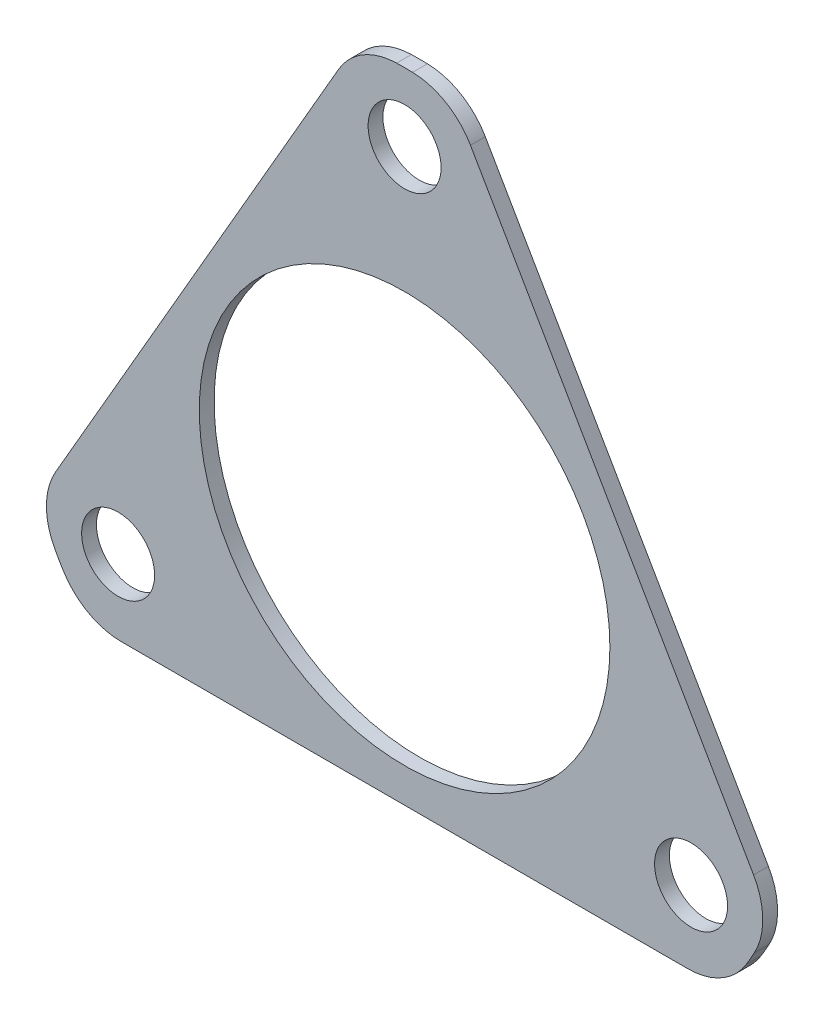
ISO-10303-21;
HEADER;
FILE_DESCRIPTION(('STEP AP214'),'2;1');
FILE_NAME('part.step','',(''),(''),'','','');
FILE_SCHEMA(('AUTOMOTIVE_DESIGN { 1 0 10303 214 1 1 1 1 }'));
ENDSEC;
DATA;
#1=APPLICATION_CONTEXT('core data for automotive mechanical design processes');
#2=APPLICATION_PROTOCOL_DEFINITION('international standard','automotive_design',2000,#1);
#3=PRODUCT_CONTEXT('',#1,'mechanical');
#4=PRODUCT('Part','Part','',(#3));
#5=PRODUCT_RELATED_PRODUCT_CATEGORY('part','',(#4));
#6=PRODUCT_DEFINITION_FORMATION('','',#4);
#7=PRODUCT_DEFINITION_CONTEXT('part definition',#1,'design');
#8=PRODUCT_DEFINITION('design','',#6,#7);
#9=PRODUCT_DEFINITION_SHAPE('','',#8);
#10=(LENGTH_UNIT() NAMED_UNIT(*) SI_UNIT(.MILLI.,.METRE.));
#11=(NAMED_UNIT(*) PLANE_ANGLE_UNIT() SI_UNIT($,.RADIAN.));
#12=(NAMED_UNIT(*) SI_UNIT($,.STERADIAN.) SOLID_ANGLE_UNIT());
#13=UNCERTAINTY_MEASURE_WITH_UNIT(LENGTH_MEASURE(1.E-05),#10,'distance_accuracy_value','');
#14=(GEOMETRIC_REPRESENTATION_CONTEXT(3) GLOBAL_UNCERTAINTY_ASSIGNED_CONTEXT((#13)) GLOBAL_UNIT_ASSIGNED_CONTEXT((#10,
#11,#12)) REPRESENTATION_CONTEXT('',''));
#15=CARTESIAN_POINT('',(0.,0.,0.));
#16=DIRECTION('',(0.,0.,1.));
#17=DIRECTION('',(1.,0.,0.));
#18=AXIS2_PLACEMENT_3D('',#15,#16,#17);
#19=CARTESIAN_POINT('',(0.,0.,8.7));
#20=DIRECTION('',(0.,0.,1.));
#21=DIRECTION('',(1.,0.,0.));
#22=AXIS2_PLACEMENT_3D('',#19,#20,#21);
#23=PLANE('',#22);
#24=CARTESIAN_POINT('',(0.,0.,8.7));
#25=DIRECTION('',(0.,0.,1.));
#26=DIRECTION('',(1.,0.,0.));
#27=AXIS2_PLACEMENT_3D('',#24,#25,#26);
#28=CIRCLE('',#27,18.);
#29=CARTESIAN_POINT('',(18.,0.,8.7));
#30=VERTEX_POINT('',#29);
#31=EDGE_CURVE('E328',#30,#30,#28,.T.);
#32=ORIENTED_EDGE('',*,*,#31,.T.);
#33=EDGE_LOOP('',(#32));
#34=FACE_BOUND('',#33,.T.);
#35=CARTESIAN_POINT('',(0.,29.,8.7));
#36=DIRECTION('',(0.,0.,-1.));
#37=DIRECTION('',(-1.,0.,0.));
#38=AXIS2_PLACEMENT_3D('',#35,#36,#37);
#39=CIRCLE('',#38,3.2);
#40=CARTESIAN_POINT('',(-3.2,29.,8.7));
#41=VERTEX_POINT('',#40);
#42=EDGE_CURVE('E185',#41,#41,#39,.T.);
#43=ORIENTED_EDGE('',*,*,#42,.F.);
#44=EDGE_LOOP('',(#43));
#45=FACE_BOUND('',#44,.T.);
#46=CARTESIAN_POINT('',(-25.1147367097503,-14.4999999999991,8.7));
#47=DIRECTION('',(0.,0.,-1.));
#48=DIRECTION('',(-1.,0.,0.));
#49=AXIS2_PLACEMENT_3D('',#46,#47,#48);
#50=CIRCLE('',#49,3.2);
#51=CARTESIAN_POINT('',(-28.3147367097503,-14.4999999999991,8.7));
#52=VERTEX_POINT('',#51);
#53=EDGE_CURVE('E331',#52,#52,#50,.T.);
#54=ORIENTED_EDGE('',*,*,#53,.F.);
#55=EDGE_LOOP('',(#54));
#56=FACE_BOUND('',#55,.T.);
#57=CARTESIAN_POINT('',(25.1147367097471,-14.5000000000009,8.7));
#58=DIRECTION('',(0.,0.,-1.));
#59=DIRECTION('',(-1.,0.,0.));
#60=AXIS2_PLACEMENT_3D('',#57,#58,#59);
#61=CIRCLE('',#60,3.2);
#62=CARTESIAN_POINT('',(21.9147367097471,-14.5000000000009,8.7));
#63=VERTEX_POINT('',#62);
#64=EDGE_CURVE('E203',#63,#63,#61,.T.);
#65=ORIENTED_EDGE('',*,*,#64,.F.);
#66=EDGE_LOOP('',(#65));
#67=FACE_BOUND('',#66,.T.);
#68=CARTESIAN_POINT('',(0.,0.,8.7));
#69=DIRECTION('',(0.,0.,-1.));
#70=DIRECTION('',(-1.,0.,0.));
#71=AXIS2_PLACEMENT_3D('',#68,#69,#70);
#72=CIRCLE('',#71,35.);
#73=CARTESIAN_POINT('',(-29.9543846627366,-18.1034482758621,8.7));
#74=VERTEX_POINT('',#73);
#75=CARTESIAN_POINT('',(-30.6552384343624,-16.8895339347298,8.7));
#76=VERTEX_POINT('',#75);
#77=EDGE_CURVE('E150',#74,#76,#72,.T.);
#78=ORIENTED_EDGE('',*,*,#77,.T.);
#79=CARTESIAN_POINT('',(-25.4000547027574,-13.9941852602047,8.7));
#80=DIRECTION('',(0.,0.,1.));
#81=DIRECTION('',(1.,0.,0.));
#82=AXIS2_PLACEMENT_3D('',#79,#80,#81);
#83=CIRCLE('',#82,6.);
#84=CARTESIAN_POINT('',(-30.5962071254641,-10.9941852602047,8.7));
#85=VERTEX_POINT('',#84);
#86=EDGE_CURVE('E225',#76,#85,#83,.F.);
#87=ORIENTED_EDGE('',*,*,#86,.T.);
#88=DIRECTION('',(0.5,0.866025403784439,0.));
#89=VECTOR('',#88,1.);
#90=CARTESIAN_POINT('',(-36.3730669589464,-21.,8.7));
#91=LINE('',#90,#89);
#92=CARTESIAN_POINT('',(-5.77685983348236,31.9941852602047,8.7));
#93=VERTEX_POINT('',#92);
#94=EDGE_CURVE('E190',#85,#93,#91,.T.);
#95=ORIENTED_EDGE('',*,*,#94,.T.);
#96=CARTESIAN_POINT('',(-0.580707410775721,28.9941852602047,8.7));
#97=DIRECTION('',(0.,0.,1.));
#98=DIRECTION('',(1.,0.,0.));
#99=AXIS2_PLACEMENT_3D('',#96,#97,#98);
#100=CIRCLE('',#99,6.);
#101=CARTESIAN_POINT('',(-0.700853771625869,34.9929822105919,8.7));
#102=VERTEX_POINT('',#101);
#103=EDGE_CURVE('E217',#93,#102,#100,.F.);
#104=ORIENTED_EDGE('',*,*,#103,.T.);
#105=CARTESIAN_POINT('',(0.700853771625863,34.9929822105919,8.7));
#106=VERTEX_POINT('',#105);
#107=EDGE_CURVE('E158',#102,#106,#72,.T.);
#108=ORIENTED_EDGE('',*,*,#107,.T.);
#109=CARTESIAN_POINT('',(0.580707410775715,28.9941852602047,8.7));
#110=DIRECTION('',(0.,0.,1.));
#111=DIRECTION('',(1.,0.,0.));
#112=AXIS2_PLACEMENT_3D('',#109,#110,#111);
#113=CIRCLE('',#112,6.);
#114=CARTESIAN_POINT('',(5.77685983348235,31.9941852602047,8.7));
#115=VERTEX_POINT('',#114);
#116=EDGE_CURVE('E176',#106,#115,#113,.F.);
#117=ORIENTED_EDGE('',*,*,#116,.T.);
#118=DIRECTION('',(0.5,-0.866025403784439,0.));
#119=VECTOR('',#118,1.);
#120=CARTESIAN_POINT('',(0.,42.,8.7));
#121=LINE('',#120,#119);
#122=CARTESIAN_POINT('',(30.5962071254641,-10.9941852602047,8.7));
#123=VERTEX_POINT('',#122);
#124=EDGE_CURVE('E194',#115,#123,#121,.T.);
#125=ORIENTED_EDGE('',*,*,#124,.T.);
#126=CARTESIAN_POINT('',(25.4000547027574,-13.9941852602047,8.7));
#127=DIRECTION('',(0.,0.,1.));
#128=DIRECTION('',(1.,0.,0.));
#129=AXIS2_PLACEMENT_3D('',#126,#127,#128);
#130=CIRCLE('',#129,6.);
#131=CARTESIAN_POINT('',(30.6552384343624,-16.8895339347298,8.7));
#132=VERTEX_POINT('',#131);
#133=EDGE_CURVE('E219',#123,#132,#130,.F.);
#134=ORIENTED_EDGE('',*,*,#133,.T.);
#135=CARTESIAN_POINT('',(29.9543846627366,-18.1034482758621,8.7));
#136=VERTEX_POINT('',#135);
#137=EDGE_CURVE('E162',#132,#136,#72,.T.);
#138=ORIENTED_EDGE('',*,*,#137,.T.);
#139=CARTESIAN_POINT('',(24.8193472919817,-15.,8.7));
#140=DIRECTION('',(0.,0.,1.));
#141=DIRECTION('',(1.,0.,0.));
#142=AXIS2_PLACEMENT_3D('',#139,#140,#141);
#143=CIRCLE('',#142,6.);
#144=CARTESIAN_POINT('',(24.8193472919817,-21.,8.7));
#145=VERTEX_POINT('',#144);
#146=EDGE_CURVE('E221',#136,#145,#143,.F.);
#147=ORIENTED_EDGE('',*,*,#146,.T.);
#148=DIRECTION('',(-1.,0.,0.));
#149=VECTOR('',#148,1.);
#150=CARTESIAN_POINT('',(36.3730669589464,-21.,8.7));
#151=LINE('',#150,#149);
#152=CARTESIAN_POINT('',(-24.8193472919817,-21.,8.7));
#153=VERTEX_POINT('',#152);
#154=EDGE_CURVE('E200',#145,#153,#151,.T.);
#155=ORIENTED_EDGE('',*,*,#154,.T.);
#156=CARTESIAN_POINT('',(-24.8193472919817,-15.,8.7));
#157=DIRECTION('',(0.,0.,1.));
#158=DIRECTION('',(1.,0.,0.));
#159=AXIS2_PLACEMENT_3D('',#156,#157,#158);
#160=CIRCLE('',#159,6.);
#161=EDGE_CURVE('E223',#153,#74,#160,.F.);
#162=ORIENTED_EDGE('',*,*,#161,.T.);
#163=EDGE_LOOP('',(#78,#87,#95,#104,#108,#117,#125,#134,#138,#147,#155,#162));
#164=FACE_BOUND('',#163,.T.);
#165=ADVANCED_FACE('F38',(#34,#45,#56,#67,#164),#23,.F.);
#166=CARTESIAN_POINT('',(0.,0.,10.));
#167=DIRECTION('',(0.,0.,1.));
#168=DIRECTION('',(1.,0.,0.));
#169=AXIS2_PLACEMENT_3D('',#166,#167,#168);
#170=PLANE('',#169);
#171=CARTESIAN_POINT('',(0.,0.,10.));
#172=DIRECTION('',(0.,0.,1.));
#173=DIRECTION('',(1.,0.,0.));
#174=AXIS2_PLACEMENT_3D('',#171,#172,#173);
#175=CIRCLE('',#174,18.);
#176=CARTESIAN_POINT('',(18.,0.,10.));
#177=VERTEX_POINT('',#176);
#178=EDGE_CURVE('E326',#177,#177,#175,.T.);
#179=ORIENTED_EDGE('',*,*,#178,.F.);
#180=EDGE_LOOP('',(#179));
#181=FACE_BOUND('',#180,.T.);
#182=CARTESIAN_POINT('',(0.,29.,10.));
#183=DIRECTION('',(0.,0.,1.));
#184=DIRECTION('',(1.,0.,0.));
#185=AXIS2_PLACEMENT_3D('',#182,#183,#184);
#186=CIRCLE('',#185,3.2);
#187=CARTESIAN_POINT('',(3.2,29.,10.));
#188=VERTEX_POINT('',#187);
#189=EDGE_CURVE('E42',#188,#188,#186,.T.);
#190=ORIENTED_EDGE('',*,*,#189,.F.);
#191=EDGE_LOOP('',(#190));
#192=FACE_BOUND('',#191,.T.);
#193=CARTESIAN_POINT('',(-25.1147367097503,-14.4999999999991,10.));
#194=DIRECTION('',(0.,0.,1.));
#195=DIRECTION('',(1.,0.,0.));
#196=AXIS2_PLACEMENT_3D('',#193,#194,#195);
#197=CIRCLE('',#196,3.2);
#198=CARTESIAN_POINT('',(-21.9147367097503,-14.4999999999991,10.));
#199=VERTEX_POINT('',#198);
#200=EDGE_CURVE('E184',#199,#199,#197,.T.);
#201=ORIENTED_EDGE('',*,*,#200,.F.);
#202=EDGE_LOOP('',(#201));
#203=FACE_BOUND('',#202,.T.);
#204=CARTESIAN_POINT('',(25.1147367097471,-14.5000000000009,10.));
#205=DIRECTION('',(0.,0.,1.));
#206=DIRECTION('',(1.,0.,0.));
#207=AXIS2_PLACEMENT_3D('',#204,#205,#206);
#208=CIRCLE('',#207,3.2);
#209=CARTESIAN_POINT('',(28.3147367097471,-14.5000000000009,10.));
#210=VERTEX_POINT('',#209);
#211=EDGE_CURVE('E182',#210,#210,#208,.T.);
#212=ORIENTED_EDGE('',*,*,#211,.F.);
#213=EDGE_LOOP('',(#212));
#214=FACE_BOUND('',#213,.T.);
#215=DIRECTION('',(-0.5,-0.866025403784439,0.));
#216=VECTOR('',#215,1.);
#217=CARTESIAN_POINT('',(-18.1865334794732,10.5,10.));
#218=LINE('',#217,#216);
#219=CARTESIAN_POINT('',(-5.77685983348236,31.9941852602047,10.));
#220=VERTEX_POINT('',#219);
#221=CARTESIAN_POINT('',(-30.5962071254641,-10.9941852602047,10.));
#222=VERTEX_POINT('',#221);
#223=EDGE_CURVE('E211',#220,#222,#218,.T.);
#224=ORIENTED_EDGE('',*,*,#223,.T.);
#225=CARTESIAN_POINT('',(-25.4000547027574,-13.9941852602047,10.));
#226=DIRECTION('',(0.,0.,1.));
#227=DIRECTION('',(1.,0.,0.));
#228=AXIS2_PLACEMENT_3D('',#225,#226,#227);
#229=CIRCLE('',#228,6.);
#230=CARTESIAN_POINT('',(-30.6552384343624,-16.8895339347298,10.));
#231=VERTEX_POINT('',#230);
#232=EDGE_CURVE('E139',#222,#231,#229,.T.);
#233=ORIENTED_EDGE('',*,*,#232,.T.);
#234=CARTESIAN_POINT('',(0.,0.,10.));
#235=DIRECTION('',(0.,0.,-1.));
#236=DIRECTION('',(-1.,0.,0.));
#237=AXIS2_PLACEMENT_3D('',#234,#235,#236);
#238=CIRCLE('',#237,35.);
#239=CARTESIAN_POINT('',(-29.9543846627366,-18.1034482758621,10.));
#240=VERTEX_POINT('',#239);
#241=EDGE_CURVE('E147',#240,#231,#238,.T.);
#242=ORIENTED_EDGE('',*,*,#241,.F.);
#243=CARTESIAN_POINT('',(-24.8193472919817,-15.,10.));
#244=DIRECTION('',(0.,0.,1.));
#245=DIRECTION('',(1.,0.,0.));
#246=AXIS2_PLACEMENT_3D('',#243,#244,#245);
#247=CIRCLE('',#246,6.);
#248=CARTESIAN_POINT('',(-24.8193472919817,-21.,10.));
#249=VERTEX_POINT('',#248);
#250=EDGE_CURVE('E130',#240,#249,#247,.T.);
#251=ORIENTED_EDGE('',*,*,#250,.T.);
#252=DIRECTION('',(1.,0.,0.));
#253=VECTOR('',#252,1.);
#254=CARTESIAN_POINT('',(0.,-21.,10.));
#255=LINE('',#254,#253);
#256=CARTESIAN_POINT('',(24.8193472919817,-21.,10.));
#257=VERTEX_POINT('',#256);
#258=EDGE_CURVE('E210',#249,#257,#255,.T.);
#259=ORIENTED_EDGE('',*,*,#258,.T.);
#260=CARTESIAN_POINT('',(24.8193472919817,-15.,10.));
#261=DIRECTION('',(0.,0.,1.));
#262=DIRECTION('',(1.,0.,0.));
#263=AXIS2_PLACEMENT_3D('',#260,#261,#262);
#264=CIRCLE('',#263,6.);
#265=CARTESIAN_POINT('',(29.9543846627366,-18.1034482758621,10.));
#266=VERTEX_POINT('',#265);
#267=EDGE_CURVE('E140',#257,#266,#264,.T.);
#268=ORIENTED_EDGE('',*,*,#267,.T.);
#269=CARTESIAN_POINT('',(30.6552384343624,-16.8895339347298,10.));
#270=VERTEX_POINT('',#269);
#271=EDGE_CURVE('E157',#270,#266,#238,.T.);
#272=ORIENTED_EDGE('',*,*,#271,.F.);
#273=CARTESIAN_POINT('',(25.4000547027574,-13.9941852602047,10.));
#274=DIRECTION('',(0.,0.,1.));
#275=DIRECTION('',(1.,0.,0.));
#276=AXIS2_PLACEMENT_3D('',#273,#274,#275);
#277=CIRCLE('',#276,6.);
#278=CARTESIAN_POINT('',(30.5962071254641,-10.9941852602047,10.));
#279=VERTEX_POINT('',#278);
#280=EDGE_CURVE('E62',#270,#279,#277,.T.);
#281=ORIENTED_EDGE('',*,*,#280,.T.);
#282=DIRECTION('',(-0.5,0.866025403784439,0.));
#283=VECTOR('',#282,1.);
#284=CARTESIAN_POINT('',(18.1865334794732,10.5,10.));
#285=LINE('',#284,#283);
#286=CARTESIAN_POINT('',(5.77685983348235,31.9941852602047,10.));
#287=VERTEX_POINT('',#286);
#288=EDGE_CURVE('E208',#279,#287,#285,.T.);
#289=ORIENTED_EDGE('',*,*,#288,.T.);
#290=CARTESIAN_POINT('',(0.580707410775715,28.9941852602047,10.));
#291=DIRECTION('',(0.,0.,1.));
#292=DIRECTION('',(1.,0.,0.));
#293=AXIS2_PLACEMENT_3D('',#290,#291,#292);
#294=CIRCLE('',#293,6.);
#295=CARTESIAN_POINT('',(0.700853771625863,34.9929822105919,10.));
#296=VERTEX_POINT('',#295);
#297=EDGE_CURVE('E175',#287,#296,#294,.T.);
#298=ORIENTED_EDGE('',*,*,#297,.T.);
#299=CARTESIAN_POINT('',(-0.700853771625869,34.9929822105919,10.));
#300=VERTEX_POINT('',#299);
#301=EDGE_CURVE('E152',#300,#296,#238,.T.);
#302=ORIENTED_EDGE('',*,*,#301,.F.);
#303=CARTESIAN_POINT('',(-0.580707410775721,28.9941852602047,10.));
#304=DIRECTION('',(0.,0.,1.));
#305=DIRECTION('',(1.,0.,0.));
#306=AXIS2_PLACEMENT_3D('',#303,#304,#305);
#307=CIRCLE('',#306,6.);
#308=EDGE_CURVE('E232',#300,#220,#307,.T.);
#309=ORIENTED_EDGE('',*,*,#308,.T.);
#310=EDGE_LOOP('',(#224,#233,#242,#251,#259,#268,#272,#281,#289,#298,#302,#309));
#311=FACE_BOUND('',#310,.T.);
#312=ADVANCED_FACE('F155',(#181,#192,#203,#214,#311),#170,.T.);
#313=CARTESIAN_POINT('',(0.,0.,10.));
#314=DIRECTION('',(0.,0.,-1.));
#315=DIRECTION('',(-1.,0.,0.));
#316=AXIS2_PLACEMENT_3D('',#313,#314,#315);
#317=CYLINDRICAL_SURFACE('',#316,35.);
#318=ORIENTED_EDGE('',*,*,#107,.F.);
#319=DIRECTION('',(0.,0.,-1.));
#320=VECTOR('',#319,1.);
#321=CARTESIAN_POINT('',(-0.70085377162587,34.9929822105919,10.));
#322=LINE('',#321,#320);
#323=EDGE_CURVE('E11',#102,#300,#322,.F.);
#324=ORIENTED_EDGE('',*,*,#323,.T.);
#325=ORIENTED_EDGE('',*,*,#301,.T.);
#326=DIRECTION('',(0.,0.,-1.));
#327=VECTOR('',#326,1.);
#328=CARTESIAN_POINT('',(0.700853771625863,34.9929822105919,10.));
#329=LINE('',#328,#327);
#330=EDGE_CURVE('E47',#296,#106,#329,.T.);
#331=ORIENTED_EDGE('',*,*,#330,.T.);
#332=EDGE_LOOP('',(#318,#324,#325,#331));
#333=FACE_BOUND('',#332,.T.);
#334=ADVANCED_FACE('F171',(#333),#317,.T.);
#335=ORIENTED_EDGE('',*,*,#241,.T.);
#336=DIRECTION('',(0.,0.,-1.));
#337=VECTOR('',#336,1.);
#338=CARTESIAN_POINT('',(-30.6552384343624,-16.8895339347298,10.));
#339=LINE('',#338,#337);
#340=EDGE_CURVE('E151',#231,#76,#339,.T.);
#341=ORIENTED_EDGE('',*,*,#340,.T.);
#342=ORIENTED_EDGE('',*,*,#77,.F.);
#343=DIRECTION('',(0.,0.,-1.));
#344=VECTOR('',#343,1.);
#345=CARTESIAN_POINT('',(-29.9543846627366,-18.1034482758621,10.));
#346=LINE('',#345,#344);
#347=EDGE_CURVE('E134',#74,#240,#346,.F.);
#348=ORIENTED_EDGE('',*,*,#347,.T.);
#349=EDGE_LOOP('',(#335,#341,#342,#348));
#350=FACE_BOUND('',#349,.T.);
#351=ADVANCED_FACE('F145',(#350),#317,.T.);
#352=ORIENTED_EDGE('',*,*,#271,.T.);
#353=DIRECTION('',(0.,0.,-1.));
#354=VECTOR('',#353,1.);
#355=CARTESIAN_POINT('',(29.9543846627366,-18.1034482758621,10.));
#356=LINE('',#355,#354);
#357=EDGE_CURVE('E243',#266,#136,#356,.T.);
#358=ORIENTED_EDGE('',*,*,#357,.T.);
#359=ORIENTED_EDGE('',*,*,#137,.F.);
#360=DIRECTION('',(0.,0.,-1.));
#361=VECTOR('',#360,1.);
#362=CARTESIAN_POINT('',(30.6552384343624,-16.8895339347298,10.));
#363=LINE('',#362,#361);
#364=EDGE_CURVE('E240',#132,#270,#363,.F.);
#365=ORIENTED_EDGE('',*,*,#364,.T.);
#366=EDGE_LOOP('',(#352,#358,#359,#365));
#367=FACE_BOUND('',#366,.T.);
#368=ADVANCED_FACE('F248',(#367),#317,.T.);
#369=CARTESIAN_POINT('',(0.,42.,18.7));
#370=DIRECTION('',(0.866025403784439,0.5,0.));
#371=DIRECTION('',(-0.5,0.866025403784439,0.));
#372=AXIS2_PLACEMENT_3D('',#369,#370,#371);
#373=PLANE('',#372);
#374=ORIENTED_EDGE('',*,*,#288,.F.);
#375=DIRECTION('',(0.,0.,-1.));
#376=VECTOR('',#375,1.);
#377=CARTESIAN_POINT('',(30.5962071254641,-10.9941852602047,18.7));
#378=LINE('',#377,#376);
#379=EDGE_CURVE('E177',#279,#123,#378,.T.);
#380=ORIENTED_EDGE('',*,*,#379,.T.);
#381=ORIENTED_EDGE('',*,*,#124,.F.);
#382=DIRECTION('',(0.,0.,-1.));
#383=VECTOR('',#382,1.);
#384=CARTESIAN_POINT('',(5.77685983348235,31.9941852602047,18.7));
#385=LINE('',#384,#383);
#386=EDGE_CURVE('E55',#115,#287,#385,.F.);
#387=ORIENTED_EDGE('',*,*,#386,.T.);
#388=EDGE_LOOP('',(#374,#380,#381,#387));
#389=FACE_BOUND('',#388,.T.);
#390=ADVANCED_FACE('F263',(#389),#373,.T.);
#391=CARTESIAN_POINT('',(36.3730669589464,-21.,18.7));
#392=DIRECTION('',(0.,-1.,0.));
#393=DIRECTION('',(1.,0.,0.));
#394=AXIS2_PLACEMENT_3D('',#391,#392,#393);
#395=PLANE('',#394);
#396=ORIENTED_EDGE('',*,*,#258,.F.);
#397=DIRECTION('',(0.,0.,-1.));
#398=VECTOR('',#397,1.);
#399=CARTESIAN_POINT('',(-24.8193472919817,-21.,18.7));
#400=LINE('',#399,#398);
#401=EDGE_CURVE('E135',#249,#153,#400,.T.);
#402=ORIENTED_EDGE('',*,*,#401,.T.);
#403=ORIENTED_EDGE('',*,*,#154,.F.);
#404=DIRECTION('',(0.,0.,-1.));
#405=VECTOR('',#404,1.);
#406=CARTESIAN_POINT('',(24.8193472919817,-21.,18.7));
#407=LINE('',#406,#405);
#408=EDGE_CURVE('E237',#145,#257,#407,.F.);
#409=ORIENTED_EDGE('',*,*,#408,.T.);
#410=EDGE_LOOP('',(#396,#402,#403,#409));
#411=FACE_BOUND('',#410,.T.);
#412=ADVANCED_FACE('F260',(#411),#395,.T.);
#413=CARTESIAN_POINT('',(-36.3730669589464,-21.,18.7));
#414=DIRECTION('',(-0.866025403784439,0.5,0.));
#415=DIRECTION('',(-0.5,-0.866025403784439,0.));
#416=AXIS2_PLACEMENT_3D('',#413,#414,#415);
#417=PLANE('',#416);
#418=ORIENTED_EDGE('',*,*,#94,.F.);
#419=DIRECTION('',(0.,0.,-1.));
#420=VECTOR('',#419,1.);
#421=CARTESIAN_POINT('',(-30.5962071254641,-10.9941852602047,18.7));
#422=LINE('',#421,#420);
#423=EDGE_CURVE('E229',#85,#222,#422,.F.);
#424=ORIENTED_EDGE('',*,*,#423,.T.);
#425=ORIENTED_EDGE('',*,*,#223,.F.);
#426=DIRECTION('',(0.,0.,-1.));
#427=VECTOR('',#426,1.);
#428=CARTESIAN_POINT('',(-5.77685983348235,31.9941852602047,18.7));
#429=LINE('',#428,#427);
#430=EDGE_CURVE('E227',#220,#93,#429,.T.);
#431=ORIENTED_EDGE('',*,*,#430,.T.);
#432=EDGE_LOOP('',(#418,#424,#425,#431));
#433=FACE_BOUND('',#432,.T.);
#434=ADVANCED_FACE('F262',(#433),#417,.T.);
#435=CARTESIAN_POINT('',(-25.4000547027574,-13.9941852602047,10.));
#436=DIRECTION('',(0.,0.,-1.));
#437=DIRECTION('',(-1.,0.,0.));
#438=AXIS2_PLACEMENT_3D('',#435,#436,#437);
#439=CYLINDRICAL_SURFACE('',#438,6.);
#440=ORIENTED_EDGE('',*,*,#232,.F.);
#441=ORIENTED_EDGE('',*,*,#423,.F.);
#442=ORIENTED_EDGE('',*,*,#86,.F.);
#443=ORIENTED_EDGE('',*,*,#340,.F.);
#444=EDGE_LOOP('',(#440,#441,#442,#443));
#445=FACE_BOUND('',#444,.T.);
#446=ADVANCED_FACE('F269',(#445),#439,.T.);
#447=CARTESIAN_POINT('',(-24.8193472919817,-15.,10.));
#448=DIRECTION('',(0.,0.,-1.));
#449=DIRECTION('',(-1.,0.,0.));
#450=AXIS2_PLACEMENT_3D('',#447,#448,#449);
#451=CYLINDRICAL_SURFACE('',#450,6.);
#452=ORIENTED_EDGE('',*,*,#161,.F.);
#453=ORIENTED_EDGE('',*,*,#401,.F.);
#454=ORIENTED_EDGE('',*,*,#250,.F.);
#455=ORIENTED_EDGE('',*,*,#347,.F.);
#456=EDGE_LOOP('',(#452,#453,#454,#455));
#457=FACE_BOUND('',#456,.T.);
#458=ADVANCED_FACE('F133',(#457),#451,.T.);
#459=CARTESIAN_POINT('',(24.8193472919817,-15.,10.));
#460=DIRECTION('',(0.,0.,-1.));
#461=DIRECTION('',(-1.,0.,0.));
#462=AXIS2_PLACEMENT_3D('',#459,#460,#461);
#463=CYLINDRICAL_SURFACE('',#462,6.);
#464=ORIENTED_EDGE('',*,*,#267,.F.);
#465=ORIENTED_EDGE('',*,*,#408,.F.);
#466=ORIENTED_EDGE('',*,*,#146,.F.);
#467=ORIENTED_EDGE('',*,*,#357,.F.);
#468=EDGE_LOOP('',(#464,#465,#466,#467));
#469=FACE_BOUND('',#468,.T.);
#470=ADVANCED_FACE('F258',(#469),#463,.T.);
#471=CARTESIAN_POINT('',(25.4000547027574,-13.9941852602047,10.));
#472=DIRECTION('',(0.,0.,-1.));
#473=DIRECTION('',(-1.,0.,0.));
#474=AXIS2_PLACEMENT_3D('',#471,#472,#473);
#475=CYLINDRICAL_SURFACE('',#474,6.);
#476=ORIENTED_EDGE('',*,*,#133,.F.);
#477=ORIENTED_EDGE('',*,*,#379,.F.);
#478=ORIENTED_EDGE('',*,*,#280,.F.);
#479=ORIENTED_EDGE('',*,*,#364,.F.);
#480=EDGE_LOOP('',(#476,#477,#478,#479));
#481=FACE_BOUND('',#480,.T.);
#482=ADVANCED_FACE('F256',(#481),#475,.T.);
#483=CARTESIAN_POINT('',(-0.580707410775721,28.9941852602047,10.));
#484=DIRECTION('',(0.,0.,-1.));
#485=DIRECTION('',(-1.,0.,0.));
#486=AXIS2_PLACEMENT_3D('',#483,#484,#485);
#487=CYLINDRICAL_SURFACE('',#486,6.);
#488=ORIENTED_EDGE('',*,*,#103,.F.);
#489=ORIENTED_EDGE('',*,*,#430,.F.);
#490=ORIENTED_EDGE('',*,*,#308,.F.);
#491=ORIENTED_EDGE('',*,*,#323,.F.);
#492=EDGE_LOOP('',(#488,#489,#490,#491));
#493=FACE_BOUND('',#492,.T.);
#494=ADVANCED_FACE('F295',(#493),#487,.T.);
#495=CARTESIAN_POINT('',(0.580707410775715,28.9941852602047,10.));
#496=DIRECTION('',(0.,0.,-1.));
#497=DIRECTION('',(-1.,0.,0.));
#498=AXIS2_PLACEMENT_3D('',#495,#496,#497);
#499=CYLINDRICAL_SURFACE('',#498,6.);
#500=ORIENTED_EDGE('',*,*,#297,.F.);
#501=ORIENTED_EDGE('',*,*,#386,.F.);
#502=ORIENTED_EDGE('',*,*,#116,.F.);
#503=ORIENTED_EDGE('',*,*,#330,.F.);
#504=EDGE_LOOP('',(#500,#501,#502,#503));
#505=FACE_BOUND('',#504,.T.);
#506=ADVANCED_FACE('F40',(#505),#499,.T.);
#507=CARTESIAN_POINT('',(25.1147367097471,-14.5000000000009,18.7));
#508=DIRECTION('',(0.,0.,-1.));
#509=DIRECTION('',(-1.,0.,0.));
#510=AXIS2_PLACEMENT_3D('',#507,#508,#509);
#511=CYLINDRICAL_SURFACE('',#510,3.2);
#512=ORIENTED_EDGE('',*,*,#211,.T.);
#513=EDGE_LOOP('',(#512));
#514=FACE_BOUND('',#513,.T.);
#515=ORIENTED_EDGE('',*,*,#64,.T.);
#516=EDGE_LOOP('',(#515));
#517=FACE_BOUND('',#516,.T.);
#518=ADVANCED_FACE('F301',(#514,#517),#511,.F.);
#519=CARTESIAN_POINT('',(-25.1147367097503,-14.4999999999991,18.7));
#520=DIRECTION('',(0.,0.,-1.));
#521=DIRECTION('',(-1.,0.,0.));
#522=AXIS2_PLACEMENT_3D('',#519,#520,#521);
#523=CYLINDRICAL_SURFACE('',#522,3.2);
#524=ORIENTED_EDGE('',*,*,#200,.T.);
#525=EDGE_LOOP('',(#524));
#526=FACE_BOUND('',#525,.T.);
#527=ORIENTED_EDGE('',*,*,#53,.T.);
#528=EDGE_LOOP('',(#527));
#529=FACE_BOUND('',#528,.T.);
#530=ADVANCED_FACE('F307',(#526,#529),#523,.F.);
#531=CARTESIAN_POINT('',(0.,29.,18.7));
#532=DIRECTION('',(0.,0.,-1.));
#533=DIRECTION('',(-1.,0.,0.));
#534=AXIS2_PLACEMENT_3D('',#531,#532,#533);
#535=CYLINDRICAL_SURFACE('',#534,3.2);
#536=ORIENTED_EDGE('',*,*,#189,.T.);
#537=EDGE_LOOP('',(#536));
#538=FACE_BOUND('',#537,.T.);
#539=ORIENTED_EDGE('',*,*,#42,.T.);
#540=EDGE_LOOP('',(#539));
#541=FACE_BOUND('',#540,.T.);
#542=ADVANCED_FACE('F312',(#538,#541),#535,.F.);
#543=CARTESIAN_POINT('',(0.,0.,0.));
#544=DIRECTION('',(0.,0.,1.));
#545=DIRECTION('',(1.,0.,0.));
#546=AXIS2_PLACEMENT_3D('',#543,#544,#545);
#547=CYLINDRICAL_SURFACE('',#546,18.);
#548=ORIENTED_EDGE('',*,*,#178,.T.);
#549=EDGE_LOOP('',(#548));
#550=FACE_BOUND('',#549,.T.);
#551=ORIENTED_EDGE('',*,*,#31,.F.);
#552=EDGE_LOOP('',(#551));
#553=FACE_BOUND('',#552,.T.);
#554=ADVANCED_FACE('F318',(#550,#553),#547,.F.);
#555=CLOSED_SHELL('',(#165,#312,#334,#351,#368,#390,#412,#434,#446,#458,#470,#482,#494,#506,
#518,#530,#542,#554));
#556=MANIFOLD_SOLID_BREP('B2',#555);
#557=ADVANCED_BREP_SHAPE_REPRESENTATION('',(#18,#556),#14);
#558=SHAPE_DEFINITION_REPRESENTATION(#9,#557);
ENDSEC;
END-ISO-10303-21;
